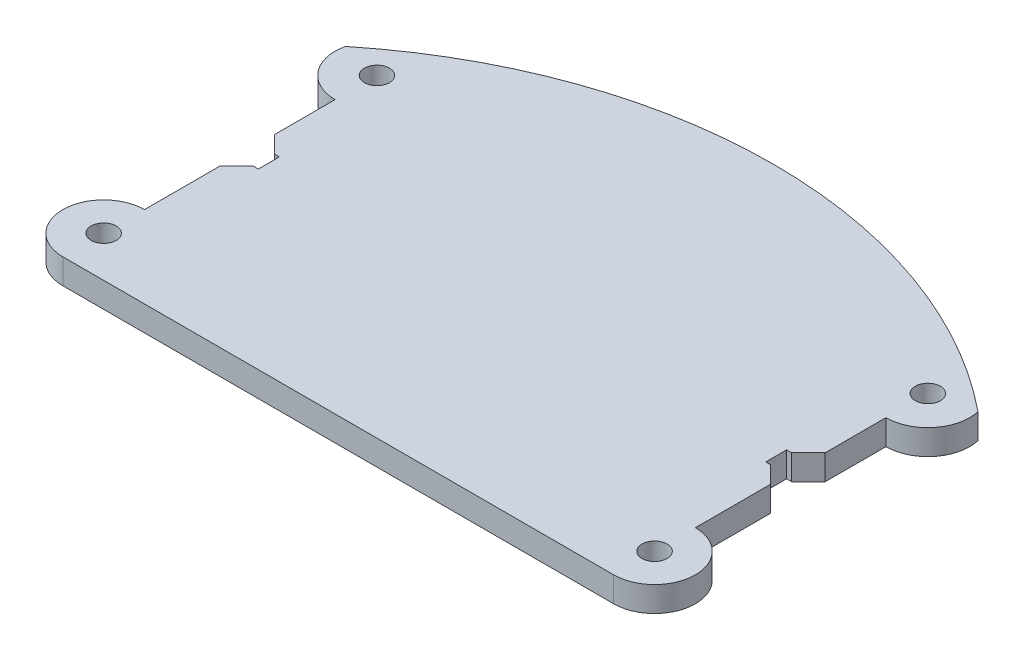
ISO-10303-21;
HEADER;
FILE_DESCRIPTION(('STEP AP214'),'2;1');
FILE_NAME('part.step','',(''),(''),'','','');
FILE_SCHEMA(('AUTOMOTIVE_DESIGN { 1 0 10303 214 1 1 1 1 }'));
ENDSEC;
DATA;
#1=APPLICATION_CONTEXT('core data for automotive mechanical design processes');
#2=APPLICATION_PROTOCOL_DEFINITION('international standard','automotive_design',2000,#1);
#3=PRODUCT_CONTEXT('',#1,'mechanical');
#4=PRODUCT('Part','Part','',(#3));
#5=PRODUCT_RELATED_PRODUCT_CATEGORY('part','',(#4));
#6=PRODUCT_DEFINITION_FORMATION('','',#4);
#7=PRODUCT_DEFINITION_CONTEXT('part definition',#1,'design');
#8=PRODUCT_DEFINITION('design','',#6,#7);
#9=PRODUCT_DEFINITION_SHAPE('','',#8);
#10=(LENGTH_UNIT() NAMED_UNIT(*) SI_UNIT(.MILLI.,.METRE.));
#11=(NAMED_UNIT(*) PLANE_ANGLE_UNIT() SI_UNIT($,.RADIAN.));
#12=(NAMED_UNIT(*) SI_UNIT($,.STERADIAN.) SOLID_ANGLE_UNIT());
#13=UNCERTAINTY_MEASURE_WITH_UNIT(LENGTH_MEASURE(1.E-05),#10,'distance_accuracy_value','');
#14=(GEOMETRIC_REPRESENTATION_CONTEXT(3) GLOBAL_UNCERTAINTY_ASSIGNED_CONTEXT((#13)) GLOBAL_UNIT_ASSIGNED_CONTEXT((#10,
#11,#12)) REPRESENTATION_CONTEXT('',''));
#15=CARTESIAN_POINT('',(0.,0.,0.));
#16=DIRECTION('',(0.,0.,1.));
#17=DIRECTION('',(1.,0.,0.));
#18=AXIS2_PLACEMENT_3D('',#15,#16,#17);
#19=CARTESIAN_POINT('',(32.89,3.,27.6232998089796));
#20=DIRECTION('',(0.,-1.,0.));
#21=DIRECTION('',(0.,0.,-1.));
#22=AXIS2_PLACEMENT_3D('',#19,#20,#21);
#23=PLANE('',#22);
#24=CARTESIAN_POINT('',(32.89,3.,27.6232998089796));
#25=DIRECTION('',(0.,1.,0.));
#26=DIRECTION('',(0.,0.,-1.));
#27=AXIS2_PLACEMENT_3D('',#24,#25,#26);
#28=CIRCLE('',#27,4.87670019102038);
#29=CARTESIAN_POINT('',(32.89,3.,32.5));
#30=VERTEX_POINT('',#29);
#31=CARTESIAN_POINT('',(32.89,3.,22.7465996179592));
#32=VERTEX_POINT('',#31);
#33=EDGE_CURVE('E257',#30,#32,#28,.T.);
#34=ORIENTED_EDGE('',*,*,#33,.T.);
#35=DIRECTION('',(0.,0.,-1.));
#36=VECTOR('',#35,1.);
#37=CARTESIAN_POINT('',(32.89,3.,22.7465996179592));
#38=LINE('',#37,#36);
#39=CARTESIAN_POINT('',(32.89,3.,13.7495066911825));
#40=VERTEX_POINT('',#39);
#41=EDGE_CURVE('E135',#32,#40,#38,.T.);
#42=ORIENTED_EDGE('',*,*,#41,.T.);
#43=DIRECTION('',(-0.707106781186548,0.,-0.707106781186547));
#44=VECTOR('',#43,1.);
#45=CARTESIAN_POINT('',(32.89,3.,13.7495066911825));
#46=LINE('',#45,#44);
#47=CARTESIAN_POINT('',(30.89,3.,11.7495066911825));
#48=VERTEX_POINT('',#47);
#49=EDGE_CURVE('E314',#40,#48,#46,.T.);
#50=ORIENTED_EDGE('',*,*,#49,.T.);
#51=DIRECTION('',(-1.,0.,0.));
#52=VECTOR('',#51,1.);
#53=CARTESIAN_POINT('',(30.89,3.,11.7495066911825));
#54=LINE('',#53,#52);
#55=CARTESIAN_POINT('',(30.29,3.,11.7495066911825));
#56=VERTEX_POINT('',#55);
#57=EDGE_CURVE('E333',#48,#56,#54,.T.);
#58=ORIENTED_EDGE('',*,*,#57,.T.);
#59=DIRECTION('',(0.,0.,-1.));
#60=VECTOR('',#59,1.);
#61=CARTESIAN_POINT('',(30.29,3.,11.7495066911825));
#62=LINE('',#61,#60);
#63=CARTESIAN_POINT('',(30.29,3.,9.25000000000001));
#64=VERTEX_POINT('',#63);
#65=EDGE_CURVE('E330',#56,#64,#62,.T.);
#66=ORIENTED_EDGE('',*,*,#65,.T.);
#67=DIRECTION('',(1.,0.,0.));
#68=VECTOR('',#67,1.);
#69=CARTESIAN_POINT('',(30.89,3.,9.25000000000001));
#70=LINE('',#69,#68);
#71=CARTESIAN_POINT('',(30.89,3.,9.25000000000001));
#72=VERTEX_POINT('',#71);
#73=EDGE_CURVE('E332',#64,#72,#70,.T.);
#74=ORIENTED_EDGE('',*,*,#73,.T.);
#75=DIRECTION('',(0.707106781186548,0.,-0.707106781186547));
#76=VECTOR('',#75,1.);
#77=CARTESIAN_POINT('',(32.89,3.,7.25000000000001));
#78=LINE('',#77,#76);
#79=CARTESIAN_POINT('',(32.89,3.,7.25000000000001));
#80=VERTEX_POINT('',#79);
#81=EDGE_CURVE('E335',#72,#80,#78,.T.);
#82=ORIENTED_EDGE('',*,*,#81,.T.);
#83=DIRECTION('',(0.,0.,-1.));
#84=VECTOR('',#83,1.);
#85=CARTESIAN_POINT('',(32.89,3.,7.25000000000001));
#86=LINE('',#85,#84);
#87=CARTESIAN_POINT('',(32.89,3.,-0.00896283115192396));
#88=VERTEX_POINT('',#87);
#89=EDGE_CURVE('E341',#80,#88,#86,.T.);
#90=ORIENTED_EDGE('',*,*,#89,.T.);
#91=DIRECTION('',(0.999999979183116,0.,0.000204043542084163));
#92=VECTOR('',#91,1.);
#93=CARTESIAN_POINT('',(32.8920404352012,3.,-0.00896241481428945));
#94=LINE('',#93,#92);
#95=CARTESIAN_POINT('',(32.8920404352012,3.,-0.00896241481432563));
#96=VERTEX_POINT('',#95);
#97=EDGE_CURVE('E343',#88,#96,#94,.T.);
#98=ORIENTED_EDGE('',*,*,#97,.T.);
#99=CARTESIAN_POINT('',(32.8920404352012,3.,-5.00896241481425));
#100=DIRECTION('',(0.,1.,0.));
#101=DIRECTION('',(0.,0.,-1.));
#102=AXIS2_PLACEMENT_3D('',#99,#100,#101);
#103=CIRCLE('',#102,4.99999999999993);
#104=CARTESIAN_POINT('',(37.7667001910205,3.,-6.12147860121143));
#105=VERTEX_POINT('',#104);
#106=EDGE_CURVE('E345',#96,#105,#103,.T.);
#107=ORIENTED_EDGE('',*,*,#106,.T.);
#108=CARTESIAN_POINT('',(3.8792265493745E-13,3.,40.50122355859));
#109=DIRECTION('',(0.,1.,0.));
#110=DIRECTION('',(0.,0.,1.));
#111=AXIS2_PLACEMENT_3D('',#108,#109,#110);
#112=CIRCLE('',#111,59.9999999999996);
#113=CARTESIAN_POINT('',(-37.7667001910211,3.,-6.12147860121064));
#114=VERTEX_POINT('',#113);
#115=EDGE_CURVE('E347',#105,#114,#112,.T.);
#116=ORIENTED_EDGE('',*,*,#115,.T.);
#117=CARTESIAN_POINT('',(-32.8920404352019,3.,-5.00896241481361));
#118=DIRECTION('',(0.,1.,0.));
#119=DIRECTION('',(0.,0.,1.));
#120=AXIS2_PLACEMENT_3D('',#117,#118,#119);
#121=CIRCLE('',#120,4.99999999999991);
#122=CARTESIAN_POINT('',(-32.8920404352019,3.,-0.00896241481367077));
#123=VERTEX_POINT('',#122);
#124=EDGE_CURVE('E349',#114,#123,#121,.T.);
#125=ORIENTED_EDGE('',*,*,#124,.T.);
#126=DIRECTION('',(0.999999979183055,0.,-0.00020404384127519));
#127=VECTOR('',#126,1.);
#128=CARTESIAN_POINT('',(-32.8920404352019,3.,-0.00896241481367077));
#129=LINE('',#128,#127);
#130=CARTESIAN_POINT('',(-32.89,3.,-0.0089628311519159));
#131=VERTEX_POINT('',#130);
#132=EDGE_CURVE('E351',#123,#131,#129,.T.);
#133=ORIENTED_EDGE('',*,*,#132,.T.);
#134=DIRECTION('',(0.,0.,1.));
#135=VECTOR('',#134,1.);
#136=CARTESIAN_POINT('',(-32.89,3.,7.25000000000001));
#137=LINE('',#136,#135);
#138=CARTESIAN_POINT('',(-32.89,3.,7.25000000000001));
#139=VERTEX_POINT('',#138);
#140=EDGE_CURVE('E353',#131,#139,#137,.T.);
#141=ORIENTED_EDGE('',*,*,#140,.T.);
#142=DIRECTION('',(0.707106781186548,0.,0.707106781186547));
#143=VECTOR('',#142,1.);
#144=CARTESIAN_POINT('',(-32.89,3.,7.25000000000001));
#145=LINE('',#144,#143);
#146=CARTESIAN_POINT('',(-30.89,3.,9.25000000000001));
#147=VERTEX_POINT('',#146);
#148=EDGE_CURVE('E355',#139,#147,#145,.T.);
#149=ORIENTED_EDGE('',*,*,#148,.T.);
#150=DIRECTION('',(1.,0.,0.));
#151=VECTOR('',#150,1.);
#152=CARTESIAN_POINT('',(-30.89,3.,9.25000000000001));
#153=LINE('',#152,#151);
#154=CARTESIAN_POINT('',(-30.29,3.,9.25000000000001));
#155=VERTEX_POINT('',#154);
#156=EDGE_CURVE('E357',#147,#155,#153,.T.);
#157=ORIENTED_EDGE('',*,*,#156,.T.);
#158=DIRECTION('',(0.,0.,1.));
#159=VECTOR('',#158,1.);
#160=CARTESIAN_POINT('',(-30.29,3.,11.7495066911825));
#161=LINE('',#160,#159);
#162=CARTESIAN_POINT('',(-30.29,3.,11.7495066911825));
#163=VERTEX_POINT('',#162);
#164=EDGE_CURVE('E359',#155,#163,#161,.T.);
#165=ORIENTED_EDGE('',*,*,#164,.T.);
#166=DIRECTION('',(-1.,0.,0.));
#167=VECTOR('',#166,1.);
#168=CARTESIAN_POINT('',(-30.89,3.,11.7495066911825));
#169=LINE('',#168,#167);
#170=CARTESIAN_POINT('',(-30.89,3.,11.7495066911825));
#171=VERTEX_POINT('',#170);
#172=EDGE_CURVE('E361',#163,#171,#169,.T.);
#173=ORIENTED_EDGE('',*,*,#172,.T.);
#174=DIRECTION('',(-0.707106781186548,0.,0.707106781186547));
#175=VECTOR('',#174,1.);
#176=CARTESIAN_POINT('',(-32.89,3.,13.7495066911825));
#177=LINE('',#176,#175);
#178=CARTESIAN_POINT('',(-32.89,3.,13.7495066911825));
#179=VERTEX_POINT('',#178);
#180=EDGE_CURVE('E196',#171,#179,#177,.T.);
#181=ORIENTED_EDGE('',*,*,#180,.T.);
#182=DIRECTION('',(0.,0.,1.));
#183=VECTOR('',#182,1.);
#184=CARTESIAN_POINT('',(-32.89,3.,22.7465996179592));
#185=LINE('',#184,#183);
#186=CARTESIAN_POINT('',(-32.89,3.,22.7465996179592));
#187=VERTEX_POINT('',#186);
#188=EDGE_CURVE('E190',#179,#187,#185,.T.);
#189=ORIENTED_EDGE('',*,*,#188,.T.);
#190=CARTESIAN_POINT('',(-32.89,3.,27.6232998089796));
#191=DIRECTION('',(0.,1.,0.));
#192=DIRECTION('',(0.,0.,1.));
#193=AXIS2_PLACEMENT_3D('',#190,#191,#192);
#194=CIRCLE('',#193,4.87670019102038);
#195=CARTESIAN_POINT('',(-32.89,3.,32.5));
#196=VERTEX_POINT('',#195);
#197=EDGE_CURVE('E194',#187,#196,#194,.T.);
#198=ORIENTED_EDGE('',*,*,#197,.T.);
#199=DIRECTION('',(1.,0.,0.));
#200=VECTOR('',#199,1.);
#201=CARTESIAN_POINT('',(-32.89,3.,32.5));
#202=LINE('',#201,#200);
#203=EDGE_CURVE('E50',#196,#30,#202,.T.);
#204=ORIENTED_EDGE('',*,*,#203,.T.);
#205=EDGE_LOOP('',(#34,#42,#50,#58,#66,#74,#82,#90,#98,#107,#116,#125,#133,#141,#149,#157,#165,
#173,#181,#189,#198,#204));
#206=FACE_BOUND('',#205,.T.);
#207=CARTESIAN_POINT('',(-32.8920404352019,3.,-5.00896241481361));
#208=DIRECTION('',(0.,1.,0.));
#209=DIRECTION('',(0.,0.,1.));
#210=AXIS2_PLACEMENT_3D('',#207,#208,#209);
#211=CIRCLE('',#210,1.50000000000085);
#212=CARTESIAN_POINT('',(-32.8920404352019,3.,-3.50896241481276));
#213=VERTEX_POINT('',#212);
#214=EDGE_CURVE('E218',#213,#213,#211,.T.);
#215=ORIENTED_EDGE('',*,*,#214,.F.);
#216=EDGE_LOOP('',(#215));
#217=FACE_BOUND('',#216,.T.);
#218=CARTESIAN_POINT('',(32.8899999999999,3.,-5.00896241481362));
#219=DIRECTION('',(0.,1.,0.));
#220=DIRECTION('',(0.,0.,1.));
#221=AXIS2_PLACEMENT_3D('',#218,#219,#220);
#222=CIRCLE('',#221,1.49999999999939);
#223=CARTESIAN_POINT('',(32.8899999999999,3.,-3.50896241481423));
#224=VERTEX_POINT('',#223);
#225=EDGE_CURVE('E425',#224,#224,#222,.T.);
#226=ORIENTED_EDGE('',*,*,#225,.F.);
#227=EDGE_LOOP('',(#226));
#228=FACE_BOUND('',#227,.T.);
#229=CARTESIAN_POINT('',(-32.89,3.,27.6232998089796));
#230=DIRECTION('',(0.,1.,0.));
#231=DIRECTION('',(0.,0.,1.));
#232=AXIS2_PLACEMENT_3D('',#229,#230,#231);
#233=CIRCLE('',#232,1.5);
#234=CARTESIAN_POINT('',(-32.89,3.,29.1232998089796));
#235=VERTEX_POINT('',#234);
#236=EDGE_CURVE('E419',#235,#235,#233,.T.);
#237=ORIENTED_EDGE('',*,*,#236,.F.);
#238=EDGE_LOOP('',(#237));
#239=FACE_BOUND('',#238,.T.);
#240=CARTESIAN_POINT('',(32.89,3.,27.6232998089796));
#241=DIRECTION('',(0.,1.,0.));
#242=DIRECTION('',(0.,0.,1.));
#243=AXIS2_PLACEMENT_3D('',#240,#241,#242);
#244=CIRCLE('',#243,1.5);
#245=CARTESIAN_POINT('',(32.89,3.,29.1232998089796));
#246=VERTEX_POINT('',#245);
#247=EDGE_CURVE('E410',#246,#246,#244,.T.);
#248=ORIENTED_EDGE('',*,*,#247,.F.);
#249=EDGE_LOOP('',(#248));
#250=FACE_BOUND('',#249,.T.);
#251=ADVANCED_FACE('F33',(#206,#217,#228,#239,#250),#23,.F.);
#252=CARTESIAN_POINT('',(32.89,0.,27.6232998089796));
#253=DIRECTION('',(0.,-1.,0.));
#254=DIRECTION('',(0.,0.,-1.));
#255=AXIS2_PLACEMENT_3D('',#252,#253,#254);
#256=PLANE('',#255);
#257=CARTESIAN_POINT('',(-32.89,0.,27.6232998089796));
#258=DIRECTION('',(0.,1.,0.));
#259=DIRECTION('',(0.,0.,1.));
#260=AXIS2_PLACEMENT_3D('',#257,#258,#259);
#261=CIRCLE('',#260,1.5);
#262=CARTESIAN_POINT('',(-32.89,0.,29.1232998089796));
#263=VERTEX_POINT('',#262);
#264=EDGE_CURVE('E416',#263,#263,#261,.T.);
#265=ORIENTED_EDGE('',*,*,#264,.T.);
#266=EDGE_LOOP('',(#265));
#267=FACE_BOUND('',#266,.T.);
#268=CARTESIAN_POINT('',(-32.8920404352019,0.,-5.00896241481361));
#269=DIRECTION('',(0.,1.,0.));
#270=DIRECTION('',(0.,0.,1.));
#271=AXIS2_PLACEMENT_3D('',#268,#269,#270);
#272=CIRCLE('',#271,1.50000000000085);
#273=CARTESIAN_POINT('',(-32.8920404352019,0.,-3.50896241481276));
#274=VERTEX_POINT('',#273);
#275=EDGE_CURVE('E428',#274,#274,#272,.T.);
#276=ORIENTED_EDGE('',*,*,#275,.T.);
#277=EDGE_LOOP('',(#276));
#278=FACE_BOUND('',#277,.T.);
#279=CARTESIAN_POINT('',(32.89,0.,27.6232998089796));
#280=DIRECTION('',(0.,1.,0.));
#281=DIRECTION('',(0.,0.,-1.));
#282=AXIS2_PLACEMENT_3D('',#279,#280,#281);
#283=CIRCLE('',#282,4.87670019102038);
#284=CARTESIAN_POINT('',(32.89,0.,32.5));
#285=VERTEX_POINT('',#284);
#286=CARTESIAN_POINT('',(32.89,0.,22.7465996179592));
#287=VERTEX_POINT('',#286);
#288=EDGE_CURVE('E214',#285,#287,#283,.T.);
#289=ORIENTED_EDGE('',*,*,#288,.F.);
#290=DIRECTION('',(1.,0.,0.));
#291=VECTOR('',#290,1.);
#292=CARTESIAN_POINT('',(-32.89,0.,32.5));
#293=LINE('',#292,#291);
#294=CARTESIAN_POINT('',(-32.89,0.,32.5));
#295=VERTEX_POINT('',#294);
#296=EDGE_CURVE('E127',#295,#285,#293,.T.);
#297=ORIENTED_EDGE('',*,*,#296,.F.);
#298=CARTESIAN_POINT('',(-32.89,0.,27.6232998089796));
#299=DIRECTION('',(0.,1.,0.));
#300=DIRECTION('',(0.,0.,1.));
#301=AXIS2_PLACEMENT_3D('',#298,#299,#300);
#302=CIRCLE('',#301,4.87670019102038);
#303=CARTESIAN_POINT('',(-32.89,0.,22.7465996179592));
#304=VERTEX_POINT('',#303);
#305=EDGE_CURVE('E121',#304,#295,#302,.T.);
#306=ORIENTED_EDGE('',*,*,#305,.F.);
#307=DIRECTION('',(0.,0.,1.));
#308=VECTOR('',#307,1.);
#309=CARTESIAN_POINT('',(-32.89,0.,22.7465996179592));
#310=LINE('',#309,#308);
#311=CARTESIAN_POINT('',(-32.89,0.,13.7495066911825));
#312=VERTEX_POINT('',#311);
#313=EDGE_CURVE('E204',#312,#304,#310,.T.);
#314=ORIENTED_EDGE('',*,*,#313,.F.);
#315=DIRECTION('',(-0.707106781186548,0.,0.707106781186547));
#316=VECTOR('',#315,1.);
#317=CARTESIAN_POINT('',(-32.89,0.,13.7495066911825));
#318=LINE('',#317,#316);
#319=CARTESIAN_POINT('',(-30.89,0.,11.7495066911825));
#320=VERTEX_POINT('',#319);
#321=EDGE_CURVE('E252',#320,#312,#318,.T.);
#322=ORIENTED_EDGE('',*,*,#321,.F.);
#323=DIRECTION('',(-1.,0.,0.));
#324=VECTOR('',#323,1.);
#325=CARTESIAN_POINT('',(-30.89,0.,11.7495066911825));
#326=LINE('',#325,#324);
#327=CARTESIAN_POINT('',(-30.29,0.,11.7495066911825));
#328=VERTEX_POINT('',#327);
#329=EDGE_CURVE('E250',#328,#320,#326,.T.);
#330=ORIENTED_EDGE('',*,*,#329,.F.);
#331=DIRECTION('',(0.,0.,1.));
#332=VECTOR('',#331,1.);
#333=CARTESIAN_POINT('',(-30.29,0.,11.7495066911825));
#334=LINE('',#333,#332);
#335=CARTESIAN_POINT('',(-30.29,0.,9.25000000000001));
#336=VERTEX_POINT('',#335);
#337=EDGE_CURVE('E248',#336,#328,#334,.T.);
#338=ORIENTED_EDGE('',*,*,#337,.F.);
#339=DIRECTION('',(1.,0.,0.));
#340=VECTOR('',#339,1.);
#341=CARTESIAN_POINT('',(-30.89,0.,9.25000000000001));
#342=LINE('',#341,#340);
#343=CARTESIAN_POINT('',(-30.89,0.,9.25000000000001));
#344=VERTEX_POINT('',#343);
#345=EDGE_CURVE('E246',#344,#336,#342,.T.);
#346=ORIENTED_EDGE('',*,*,#345,.F.);
#347=DIRECTION('',(0.707106781186548,0.,0.707106781186547));
#348=VECTOR('',#347,1.);
#349=CARTESIAN_POINT('',(-32.89,0.,7.25000000000001));
#350=LINE('',#349,#348);
#351=CARTESIAN_POINT('',(-32.89,0.,7.25000000000001));
#352=VERTEX_POINT('',#351);
#353=EDGE_CURVE('E244',#352,#344,#350,.T.);
#354=ORIENTED_EDGE('',*,*,#353,.F.);
#355=DIRECTION('',(0.,0.,1.));
#356=VECTOR('',#355,1.);
#357=CARTESIAN_POINT('',(-32.89,0.,7.25000000000001));
#358=LINE('',#357,#356);
#359=CARTESIAN_POINT('',(-32.89,0.,-0.0089628311519159));
#360=VERTEX_POINT('',#359);
#361=EDGE_CURVE('E242',#360,#352,#358,.T.);
#362=ORIENTED_EDGE('',*,*,#361,.F.);
#363=DIRECTION('',(0.999999979183055,0.,-0.00020404384127519));
#364=VECTOR('',#363,1.);
#365=CARTESIAN_POINT('',(-32.8920404352019,0.,-0.00896241481367077));
#366=LINE('',#365,#364);
#367=CARTESIAN_POINT('',(-32.8920404352019,0.,-0.00896241481367077));
#368=VERTEX_POINT('',#367);
#369=EDGE_CURVE('E240',#368,#360,#366,.T.);
#370=ORIENTED_EDGE('',*,*,#369,.F.);
#371=CARTESIAN_POINT('',(-32.8920404352019,0.,-5.00896241481361));
#372=DIRECTION('',(0.,1.,0.));
#373=DIRECTION('',(0.,0.,1.));
#374=AXIS2_PLACEMENT_3D('',#371,#372,#373);
#375=CIRCLE('',#374,4.99999999999991);
#376=CARTESIAN_POINT('',(-37.7667001910211,0.,-6.12147860121064));
#377=VERTEX_POINT('',#376);
#378=EDGE_CURVE('E238',#377,#368,#375,.T.);
#379=ORIENTED_EDGE('',*,*,#378,.F.);
#380=CARTESIAN_POINT('',(3.8792265493745E-13,0.,40.50122355859));
#381=DIRECTION('',(0.,1.,0.));
#382=DIRECTION('',(0.,0.,1.));
#383=AXIS2_PLACEMENT_3D('',#380,#381,#382);
#384=CIRCLE('',#383,59.9999999999996);
#385=CARTESIAN_POINT('',(37.7667001910205,0.,-6.12147860121143));
#386=VERTEX_POINT('',#385);
#387=EDGE_CURVE('E236',#386,#377,#384,.T.);
#388=ORIENTED_EDGE('',*,*,#387,.F.);
#389=CARTESIAN_POINT('',(32.8920404352012,0.,-5.00896241481425));
#390=DIRECTION('',(0.,1.,0.));
#391=DIRECTION('',(0.,0.,-1.));
#392=AXIS2_PLACEMENT_3D('',#389,#390,#391);
#393=CIRCLE('',#392,4.99999999999993);
#394=CARTESIAN_POINT('',(32.8920404352012,0.,-0.00896241481432563));
#395=VERTEX_POINT('',#394);
#396=EDGE_CURVE('E234',#395,#386,#393,.T.);
#397=ORIENTED_EDGE('',*,*,#396,.F.);
#398=DIRECTION('',(0.999999979183116,0.,0.000204043542084163));
#399=VECTOR('',#398,1.);
#400=CARTESIAN_POINT('',(32.8920404352012,0.,-0.00896241481428945));
#401=LINE('',#400,#399);
#402=CARTESIAN_POINT('',(32.89,0.,-0.00896283115192396));
#403=VERTEX_POINT('',#402);
#404=EDGE_CURVE('E232',#403,#395,#401,.T.);
#405=ORIENTED_EDGE('',*,*,#404,.F.);
#406=DIRECTION('',(0.,0.,-1.));
#407=VECTOR('',#406,1.);
#408=CARTESIAN_POINT('',(32.89,0.,7.25000000000001));
#409=LINE('',#408,#407);
#410=CARTESIAN_POINT('',(32.89,0.,7.25000000000001));
#411=VERTEX_POINT('',#410);
#412=EDGE_CURVE('E230',#411,#403,#409,.T.);
#413=ORIENTED_EDGE('',*,*,#412,.F.);
#414=DIRECTION('',(0.707106781186548,0.,-0.707106781186547));
#415=VECTOR('',#414,1.);
#416=CARTESIAN_POINT('',(32.89,0.,7.25000000000001));
#417=LINE('',#416,#415);
#418=CARTESIAN_POINT('',(30.89,0.,9.25000000000001));
#419=VERTEX_POINT('',#418);
#420=EDGE_CURVE('E228',#419,#411,#417,.T.);
#421=ORIENTED_EDGE('',*,*,#420,.F.);
#422=DIRECTION('',(1.,0.,0.));
#423=VECTOR('',#422,1.);
#424=CARTESIAN_POINT('',(30.89,0.,9.25000000000001));
#425=LINE('',#424,#423);
#426=CARTESIAN_POINT('',(30.29,0.,9.25000000000001));
#427=VERTEX_POINT('',#426);
#428=EDGE_CURVE('E226',#427,#419,#425,.T.);
#429=ORIENTED_EDGE('',*,*,#428,.F.);
#430=DIRECTION('',(0.,0.,-1.));
#431=VECTOR('',#430,1.);
#432=CARTESIAN_POINT('',(30.29,0.,11.7495066911825));
#433=LINE('',#432,#431);
#434=CARTESIAN_POINT('',(30.29,0.,11.7495066911825));
#435=VERTEX_POINT('',#434);
#436=EDGE_CURVE('E224',#435,#427,#433,.T.);
#437=ORIENTED_EDGE('',*,*,#436,.F.);
#438=DIRECTION('',(-1.,0.,0.));
#439=VECTOR('',#438,1.);
#440=CARTESIAN_POINT('',(30.89,0.,11.7495066911825));
#441=LINE('',#440,#439);
#442=CARTESIAN_POINT('',(30.89,0.,11.7495066911825));
#443=VERTEX_POINT('',#442);
#444=EDGE_CURVE('E222',#443,#435,#441,.T.);
#445=ORIENTED_EDGE('',*,*,#444,.F.);
#446=DIRECTION('',(-0.707106781186548,0.,-0.707106781186547));
#447=VECTOR('',#446,1.);
#448=CARTESIAN_POINT('',(32.89,0.,13.7495066911825));
#449=LINE('',#448,#447);
#450=CARTESIAN_POINT('',(32.89,0.,13.7495066911825));
#451=VERTEX_POINT('',#450);
#452=EDGE_CURVE('E220',#451,#443,#449,.T.);
#453=ORIENTED_EDGE('',*,*,#452,.F.);
#454=DIRECTION('',(0.,0.,-1.));
#455=VECTOR('',#454,1.);
#456=CARTESIAN_POINT('',(32.89,0.,22.7465996179592));
#457=LINE('',#456,#455);
#458=EDGE_CURVE('E217',#287,#451,#457,.T.);
#459=ORIENTED_EDGE('',*,*,#458,.F.);
#460=EDGE_LOOP('',(#289,#297,#306,#314,#322,#330,#338,#346,#354,#362,#370,#379,#388,#397,#405,
#413,#421,#429,#437,#445,#453,#459));
#461=FACE_BOUND('',#460,.T.);
#462=CARTESIAN_POINT('',(32.8899999999999,0.,-5.00896241481362));
#463=DIRECTION('',(0.,1.,0.));
#464=DIRECTION('',(0.,0.,1.));
#465=AXIS2_PLACEMENT_3D('',#462,#463,#464);
#466=CIRCLE('',#465,1.49999999999939);
#467=CARTESIAN_POINT('',(32.8899999999999,0.,-3.50896241481423));
#468=VERTEX_POINT('',#467);
#469=EDGE_CURVE('E422',#468,#468,#466,.T.);
#470=ORIENTED_EDGE('',*,*,#469,.T.);
#471=EDGE_LOOP('',(#470));
#472=FACE_BOUND('',#471,.T.);
#473=CARTESIAN_POINT('',(32.89,0.,27.6232998089796));
#474=DIRECTION('',(0.,1.,0.));
#475=DIRECTION('',(0.,0.,1.));
#476=AXIS2_PLACEMENT_3D('',#473,#474,#475);
#477=CIRCLE('',#476,1.5);
#478=CARTESIAN_POINT('',(32.89,0.,29.1232998089796));
#479=VERTEX_POINT('',#478);
#480=EDGE_CURVE('E413',#479,#479,#477,.T.);
#481=ORIENTED_EDGE('',*,*,#480,.T.);
#482=EDGE_LOOP('',(#481));
#483=FACE_BOUND('',#482,.T.);
#484=ADVANCED_FACE('F318',(#267,#278,#461,#472,#483),#256,.T.);
#485=CARTESIAN_POINT('',(32.89,3.,27.6232998089796));
#486=DIRECTION('',(0.,-1.,0.));
#487=DIRECTION('',(0.,0.,-1.));
#488=AXIS2_PLACEMENT_3D('',#485,#486,#487);
#489=CYLINDRICAL_SURFACE('',#488,4.87670019102038);
#490=ORIENTED_EDGE('',*,*,#288,.T.);
#491=DIRECTION('',(0.,-1.,0.));
#492=VECTOR('',#491,1.);
#493=CARTESIAN_POINT('',(32.89,3.,22.7465996179592));
#494=LINE('',#493,#492);
#495=EDGE_CURVE('E11',#32,#287,#494,.T.);
#496=ORIENTED_EDGE('',*,*,#495,.F.);
#497=ORIENTED_EDGE('',*,*,#33,.F.);
#498=DIRECTION('',(0.,-1.,0.));
#499=VECTOR('',#498,1.);
#500=CARTESIAN_POINT('',(32.89,3.,32.5));
#501=LINE('',#500,#499);
#502=EDGE_CURVE('E210',#30,#285,#501,.T.);
#503=ORIENTED_EDGE('',*,*,#502,.T.);
#504=EDGE_LOOP('',(#490,#496,#497,#503));
#505=FACE_BOUND('',#504,.T.);
#506=ADVANCED_FACE('F35',(#505),#489,.T.);
#507=CARTESIAN_POINT('',(32.89,3.,22.7465996179592));
#508=DIRECTION('',(-1.,0.,0.));
#509=DIRECTION('',(0.,0.,1.));
#510=AXIS2_PLACEMENT_3D('',#507,#508,#509);
#511=PLANE('',#510);
#512=ORIENTED_EDGE('',*,*,#458,.T.);
#513=DIRECTION('',(0.,-1.,0.));
#514=VECTOR('',#513,1.);
#515=CARTESIAN_POINT('',(32.89,3.,13.7495066911825));
#516=LINE('',#515,#514);
#517=EDGE_CURVE('E42',#40,#451,#516,.T.);
#518=ORIENTED_EDGE('',*,*,#517,.F.);
#519=ORIENTED_EDGE('',*,*,#41,.F.);
#520=ORIENTED_EDGE('',*,*,#495,.T.);
#521=EDGE_LOOP('',(#512,#518,#519,#520));
#522=FACE_BOUND('',#521,.T.);
#523=ADVANCED_FACE('F640',(#522),#511,.F.);
#524=CARTESIAN_POINT('',(32.89,3.,13.7495066911825));
#525=DIRECTION('',(-0.707106781186547,0.,0.707106781186548));
#526=DIRECTION('',(0.707106781186548,0.,0.707106781186547));
#527=AXIS2_PLACEMENT_3D('',#524,#525,#526);
#528=PLANE('',#527);
#529=ORIENTED_EDGE('',*,*,#452,.T.);
#530=DIRECTION('',(0.,-1.,0.));
#531=VECTOR('',#530,1.);
#532=CARTESIAN_POINT('',(30.89,3.,11.7495066911825));
#533=LINE('',#532,#531);
#534=EDGE_CURVE('E306',#48,#443,#533,.T.);
#535=ORIENTED_EDGE('',*,*,#534,.F.);
#536=ORIENTED_EDGE('',*,*,#49,.F.);
#537=ORIENTED_EDGE('',*,*,#517,.T.);
#538=EDGE_LOOP('',(#529,#535,#536,#537));
#539=FACE_BOUND('',#538,.T.);
#540=ADVANCED_FACE('F312',(#539),#528,.F.);
#541=CARTESIAN_POINT('',(30.89,3.,11.7495066911825));
#542=DIRECTION('',(0.,0.,1.));
#543=DIRECTION('',(1.,0.,0.));
#544=AXIS2_PLACEMENT_3D('',#541,#542,#543);
#545=PLANE('',#544);
#546=ORIENTED_EDGE('',*,*,#444,.T.);
#547=DIRECTION('',(0.,-1.,0.));
#548=VECTOR('',#547,1.);
#549=CARTESIAN_POINT('',(30.29,3.,11.7495066911825));
#550=LINE('',#549,#548);
#551=EDGE_CURVE('E303',#56,#435,#550,.T.);
#552=ORIENTED_EDGE('',*,*,#551,.F.);
#553=ORIENTED_EDGE('',*,*,#57,.F.);
#554=ORIENTED_EDGE('',*,*,#534,.T.);
#555=EDGE_LOOP('',(#546,#552,#553,#554));
#556=FACE_BOUND('',#555,.T.);
#557=ADVANCED_FACE('F324',(#556),#545,.F.);
#558=CARTESIAN_POINT('',(30.29,3.,11.7495066911825));
#559=DIRECTION('',(-1.,0.,0.));
#560=DIRECTION('',(0.,0.,1.));
#561=AXIS2_PLACEMENT_3D('',#558,#559,#560);
#562=PLANE('',#561);
#563=ORIENTED_EDGE('',*,*,#436,.T.);
#564=DIRECTION('',(0.,-1.,0.));
#565=VECTOR('',#564,1.);
#566=CARTESIAN_POINT('',(30.29,3.,9.25000000000001));
#567=LINE('',#566,#565);
#568=EDGE_CURVE('E300',#64,#427,#567,.T.);
#569=ORIENTED_EDGE('',*,*,#568,.F.);
#570=ORIENTED_EDGE('',*,*,#65,.F.);
#571=ORIENTED_EDGE('',*,*,#551,.T.);
#572=EDGE_LOOP('',(#563,#569,#570,#571));
#573=FACE_BOUND('',#572,.T.);
#574=ADVANCED_FACE('F328',(#573),#562,.F.);
#575=CARTESIAN_POINT('',(30.89,3.,9.25000000000001));
#576=DIRECTION('',(0.,0.,-1.));
#577=DIRECTION('',(-1.,0.,0.));
#578=AXIS2_PLACEMENT_3D('',#575,#576,#577);
#579=PLANE('',#578);
#580=ORIENTED_EDGE('',*,*,#428,.T.);
#581=DIRECTION('',(0.,-1.,0.));
#582=VECTOR('',#581,1.);
#583=CARTESIAN_POINT('',(30.89,3.,9.25000000000001));
#584=LINE('',#583,#582);
#585=EDGE_CURVE('E297',#72,#419,#584,.T.);
#586=ORIENTED_EDGE('',*,*,#585,.F.);
#587=ORIENTED_EDGE('',*,*,#73,.F.);
#588=ORIENTED_EDGE('',*,*,#568,.T.);
#589=EDGE_LOOP('',(#580,#586,#587,#588));
#590=FACE_BOUND('',#589,.T.);
#591=ADVANCED_FACE('F605',(#590),#579,.F.);
#592=CARTESIAN_POINT('',(32.89,3.,7.25000000000001));
#593=DIRECTION('',(-0.707106781186547,0.,-0.707106781186548));
#594=DIRECTION('',(-0.707106781186548,0.,0.707106781186547));
#595=AXIS2_PLACEMENT_3D('',#592,#593,#594);
#596=PLANE('',#595);
#597=ORIENTED_EDGE('',*,*,#420,.T.);
#598=DIRECTION('',(0.,-1.,0.));
#599=VECTOR('',#598,1.);
#600=CARTESIAN_POINT('',(32.89,3.,7.25000000000001));
#601=LINE('',#600,#599);
#602=EDGE_CURVE('E294',#80,#411,#601,.T.);
#603=ORIENTED_EDGE('',*,*,#602,.F.);
#604=ORIENTED_EDGE('',*,*,#81,.F.);
#605=ORIENTED_EDGE('',*,*,#585,.T.);
#606=EDGE_LOOP('',(#597,#603,#604,#605));
#607=FACE_BOUND('',#606,.T.);
#608=ADVANCED_FACE('F595',(#607),#596,.F.);
#609=CARTESIAN_POINT('',(32.89,3.,7.25000000000001));
#610=DIRECTION('',(-1.,0.,0.));
#611=DIRECTION('',(0.,0.,1.));
#612=AXIS2_PLACEMENT_3D('',#609,#610,#611);
#613=PLANE('',#612);
#614=ORIENTED_EDGE('',*,*,#412,.T.);
#615=DIRECTION('',(0.,-1.,0.));
#616=VECTOR('',#615,1.);
#617=CARTESIAN_POINT('',(32.89,3.,-0.00896283115192396));
#618=LINE('',#617,#616);
#619=EDGE_CURVE('E291',#88,#403,#618,.T.);
#620=ORIENTED_EDGE('',*,*,#619,.F.);
#621=ORIENTED_EDGE('',*,*,#89,.F.);
#622=ORIENTED_EDGE('',*,*,#602,.T.);
#623=EDGE_LOOP('',(#614,#620,#621,#622));
#624=FACE_BOUND('',#623,.T.);
#625=ADVANCED_FACE('F585',(#624),#613,.F.);
#626=CARTESIAN_POINT('',(32.8920404352012,3.,-0.00896241481428945));
#627=DIRECTION('',(0.000204043542084163,0.,-0.999999979183116));
#628=DIRECTION('',(-0.999999979183116,0.,-0.000204043542084163));
#629=AXIS2_PLACEMENT_3D('',#626,#627,#628);
#630=PLANE('',#629);
#631=ORIENTED_EDGE('',*,*,#404,.T.);
#632=DIRECTION('',(0.,-1.,0.));
#633=VECTOR('',#632,1.);
#634=CARTESIAN_POINT('',(32.8920404352012,3.,-0.00896241481432563));
#635=LINE('',#634,#633);
#636=EDGE_CURVE('E288',#96,#395,#635,.T.);
#637=ORIENTED_EDGE('',*,*,#636,.F.);
#638=ORIENTED_EDGE('',*,*,#97,.F.);
#639=ORIENTED_EDGE('',*,*,#619,.T.);
#640=EDGE_LOOP('',(#631,#637,#638,#639));
#641=FACE_BOUND('',#640,.T.);
#642=ADVANCED_FACE('F575',(#641),#630,.F.);
#643=CARTESIAN_POINT('',(32.8920404352012,3.,-5.00896241481425));
#644=DIRECTION('',(0.,-1.,0.));
#645=DIRECTION('',(0.,0.,-1.));
#646=AXIS2_PLACEMENT_3D('',#643,#644,#645);
#647=CYLINDRICAL_SURFACE('',#646,4.99999999999993);
#648=ORIENTED_EDGE('',*,*,#396,.T.);
#649=DIRECTION('',(0.,-1.,0.));
#650=VECTOR('',#649,1.);
#651=CARTESIAN_POINT('',(37.7667001910205,3.,-6.12147860121143));
#652=LINE('',#651,#650);
#653=EDGE_CURVE('E285',#105,#386,#652,.T.);
#654=ORIENTED_EDGE('',*,*,#653,.F.);
#655=ORIENTED_EDGE('',*,*,#106,.F.);
#656=ORIENTED_EDGE('',*,*,#636,.T.);
#657=EDGE_LOOP('',(#648,#654,#655,#656));
#658=FACE_BOUND('',#657,.T.);
#659=ADVANCED_FACE('F565',(#658),#647,.T.);
#660=CARTESIAN_POINT('',(3.8792265493745E-13,3.,40.50122355859));
#661=DIRECTION('',(0.,-1.,0.));
#662=DIRECTION('',(0.,0.,-1.));
#663=AXIS2_PLACEMENT_3D('',#660,#661,#662);
#664=CYLINDRICAL_SURFACE('',#663,59.9999999999996);
#665=ORIENTED_EDGE('',*,*,#387,.T.);
#666=DIRECTION('',(0.,-1.,0.));
#667=VECTOR('',#666,1.);
#668=CARTESIAN_POINT('',(-37.7667001910211,3.,-6.12147860121064));
#669=LINE('',#668,#667);
#670=EDGE_CURVE('E282',#114,#377,#669,.T.);
#671=ORIENTED_EDGE('',*,*,#670,.F.);
#672=ORIENTED_EDGE('',*,*,#115,.F.);
#673=ORIENTED_EDGE('',*,*,#653,.T.);
#674=EDGE_LOOP('',(#665,#671,#672,#673));
#675=FACE_BOUND('',#674,.T.);
#676=ADVANCED_FACE('F555',(#675),#664,.T.);
#677=CARTESIAN_POINT('',(-32.8920404352019,3.,-5.00896241481361));
#678=DIRECTION('',(0.,-1.,0.));
#679=DIRECTION('',(0.,0.,-1.));
#680=AXIS2_PLACEMENT_3D('',#677,#678,#679);
#681=CYLINDRICAL_SURFACE('',#680,4.99999999999991);
#682=ORIENTED_EDGE('',*,*,#378,.T.);
#683=DIRECTION('',(0.,-1.,0.));
#684=VECTOR('',#683,1.);
#685=CARTESIAN_POINT('',(-32.8920404352019,3.,-0.00896241481367077));
#686=LINE('',#685,#684);
#687=EDGE_CURVE('E279',#123,#368,#686,.T.);
#688=ORIENTED_EDGE('',*,*,#687,.F.);
#689=ORIENTED_EDGE('',*,*,#124,.F.);
#690=ORIENTED_EDGE('',*,*,#670,.T.);
#691=EDGE_LOOP('',(#682,#688,#689,#690));
#692=FACE_BOUND('',#691,.T.);
#693=ADVANCED_FACE('F545',(#692),#681,.T.);
#694=CARTESIAN_POINT('',(-32.8920404352019,3.,-0.00896241481367077));
#695=DIRECTION('',(-0.00020404384127519,0.,-0.999999979183055));
#696=DIRECTION('',(-0.999999979183055,0.,0.00020404384127519));
#697=AXIS2_PLACEMENT_3D('',#694,#695,#696);
#698=PLANE('',#697);
#699=ORIENTED_EDGE('',*,*,#369,.T.);
#700=DIRECTION('',(0.,-1.,0.));
#701=VECTOR('',#700,1.);
#702=CARTESIAN_POINT('',(-32.89,3.,-0.0089628311519159));
#703=LINE('',#702,#701);
#704=EDGE_CURVE('E276',#131,#360,#703,.T.);
#705=ORIENTED_EDGE('',*,*,#704,.F.);
#706=ORIENTED_EDGE('',*,*,#132,.F.);
#707=ORIENTED_EDGE('',*,*,#687,.T.);
#708=EDGE_LOOP('',(#699,#705,#706,#707));
#709=FACE_BOUND('',#708,.T.);
#710=ADVANCED_FACE('F535',(#709),#698,.F.);
#711=CARTESIAN_POINT('',(-32.89,3.,7.25000000000001));
#712=DIRECTION('',(1.,0.,0.));
#713=DIRECTION('',(0.,0.,-1.));
#714=AXIS2_PLACEMENT_3D('',#711,#712,#713);
#715=PLANE('',#714);
#716=ORIENTED_EDGE('',*,*,#361,.T.);
#717=DIRECTION('',(0.,-1.,0.));
#718=VECTOR('',#717,1.);
#719=CARTESIAN_POINT('',(-32.89,3.,7.25000000000001));
#720=LINE('',#719,#718);
#721=EDGE_CURVE('E273',#139,#352,#720,.T.);
#722=ORIENTED_EDGE('',*,*,#721,.F.);
#723=ORIENTED_EDGE('',*,*,#140,.F.);
#724=ORIENTED_EDGE('',*,*,#704,.T.);
#725=EDGE_LOOP('',(#716,#722,#723,#724));
#726=FACE_BOUND('',#725,.T.);
#727=ADVANCED_FACE('F525',(#726),#715,.F.);
#728=CARTESIAN_POINT('',(-32.89,3.,7.25000000000001));
#729=DIRECTION('',(0.707106781186547,0.,-0.707106781186548));
#730=DIRECTION('',(-0.707106781186548,0.,-0.707106781186547));
#731=AXIS2_PLACEMENT_3D('',#728,#729,#730);
#732=PLANE('',#731);
#733=ORIENTED_EDGE('',*,*,#353,.T.);
#734=DIRECTION('',(0.,-1.,0.));
#735=VECTOR('',#734,1.);
#736=CARTESIAN_POINT('',(-30.89,3.,9.25000000000001));
#737=LINE('',#736,#735);
#738=EDGE_CURVE('E270',#147,#344,#737,.T.);
#739=ORIENTED_EDGE('',*,*,#738,.F.);
#740=ORIENTED_EDGE('',*,*,#148,.F.);
#741=ORIENTED_EDGE('',*,*,#721,.T.);
#742=EDGE_LOOP('',(#733,#739,#740,#741));
#743=FACE_BOUND('',#742,.T.);
#744=ADVANCED_FACE('F515',(#743),#732,.F.);
#745=CARTESIAN_POINT('',(-30.89,3.,9.25000000000001));
#746=DIRECTION('',(0.,0.,-1.));
#747=DIRECTION('',(-1.,0.,0.));
#748=AXIS2_PLACEMENT_3D('',#745,#746,#747);
#749=PLANE('',#748);
#750=ORIENTED_EDGE('',*,*,#345,.T.);
#751=DIRECTION('',(0.,-1.,0.));
#752=VECTOR('',#751,1.);
#753=CARTESIAN_POINT('',(-30.29,3.,9.25000000000001));
#754=LINE('',#753,#752);
#755=EDGE_CURVE('E267',#155,#336,#754,.T.);
#756=ORIENTED_EDGE('',*,*,#755,.F.);
#757=ORIENTED_EDGE('',*,*,#156,.F.);
#758=ORIENTED_EDGE('',*,*,#738,.T.);
#759=EDGE_LOOP('',(#750,#756,#757,#758));
#760=FACE_BOUND('',#759,.T.);
#761=ADVANCED_FACE('F505',(#760),#749,.F.);
#762=CARTESIAN_POINT('',(-30.29,3.,11.7495066911825));
#763=DIRECTION('',(1.,0.,0.));
#764=DIRECTION('',(0.,0.,-1.));
#765=AXIS2_PLACEMENT_3D('',#762,#763,#764);
#766=PLANE('',#765);
#767=ORIENTED_EDGE('',*,*,#337,.T.);
#768=DIRECTION('',(0.,-1.,0.));
#769=VECTOR('',#768,1.);
#770=CARTESIAN_POINT('',(-30.29,3.,11.7495066911825));
#771=LINE('',#770,#769);
#772=EDGE_CURVE('E264',#163,#328,#771,.T.);
#773=ORIENTED_EDGE('',*,*,#772,.F.);
#774=ORIENTED_EDGE('',*,*,#164,.F.);
#775=ORIENTED_EDGE('',*,*,#755,.T.);
#776=EDGE_LOOP('',(#767,#773,#774,#775));
#777=FACE_BOUND('',#776,.T.);
#778=ADVANCED_FACE('F496',(#777),#766,.F.);
#779=CARTESIAN_POINT('',(-30.89,3.,11.7495066911825));
#780=DIRECTION('',(0.,0.,1.));
#781=DIRECTION('',(1.,0.,0.));
#782=AXIS2_PLACEMENT_3D('',#779,#780,#781);
#783=PLANE('',#782);
#784=ORIENTED_EDGE('',*,*,#329,.T.);
#785=DIRECTION('',(0.,-1.,0.));
#786=VECTOR('',#785,1.);
#787=CARTESIAN_POINT('',(-30.89,3.,11.7495066911825));
#788=LINE('',#787,#786);
#789=EDGE_CURVE('E261',#171,#320,#788,.T.);
#790=ORIENTED_EDGE('',*,*,#789,.F.);
#791=ORIENTED_EDGE('',*,*,#172,.F.);
#792=ORIENTED_EDGE('',*,*,#772,.T.);
#793=EDGE_LOOP('',(#784,#790,#791,#792));
#794=FACE_BOUND('',#793,.T.);
#795=ADVANCED_FACE('F367',(#794),#783,.F.);
#796=CARTESIAN_POINT('',(-32.89,3.,13.7495066911825));
#797=DIRECTION('',(0.707106781186547,0.,0.707106781186548));
#798=DIRECTION('',(0.707106781186548,0.,-0.707106781186547));
#799=AXIS2_PLACEMENT_3D('',#796,#797,#798);
#800=PLANE('',#799);
#801=ORIENTED_EDGE('',*,*,#321,.T.);
#802=DIRECTION('',(0.,-1.,0.));
#803=VECTOR('',#802,1.);
#804=CARTESIAN_POINT('',(-32.89,3.,13.7495066911825));
#805=LINE('',#804,#803);
#806=EDGE_CURVE('E205',#179,#312,#805,.T.);
#807=ORIENTED_EDGE('',*,*,#806,.F.);
#808=ORIENTED_EDGE('',*,*,#180,.F.);
#809=ORIENTED_EDGE('',*,*,#789,.T.);
#810=EDGE_LOOP('',(#801,#807,#808,#809));
#811=FACE_BOUND('',#810,.T.);
#812=ADVANCED_FACE('F371',(#811),#800,.F.);
#813=CARTESIAN_POINT('',(-32.89,3.,22.7465996179592));
#814=DIRECTION('',(1.,0.,0.));
#815=DIRECTION('',(0.,0.,-1.));
#816=AXIS2_PLACEMENT_3D('',#813,#814,#815);
#817=PLANE('',#816);
#818=ORIENTED_EDGE('',*,*,#313,.T.);
#819=DIRECTION('',(0.,-1.,0.));
#820=VECTOR('',#819,1.);
#821=CARTESIAN_POINT('',(-32.89,3.,22.7465996179592));
#822=LINE('',#821,#820);
#823=EDGE_CURVE('E201',#187,#304,#822,.T.);
#824=ORIENTED_EDGE('',*,*,#823,.F.);
#825=ORIENTED_EDGE('',*,*,#188,.F.);
#826=ORIENTED_EDGE('',*,*,#806,.T.);
#827=EDGE_LOOP('',(#818,#824,#825,#826));
#828=FACE_BOUND('',#827,.T.);
#829=ADVANCED_FACE('F202',(#828),#817,.F.);
#830=CARTESIAN_POINT('',(-32.89,3.,27.6232998089796));
#831=DIRECTION('',(0.,-1.,0.));
#832=DIRECTION('',(0.,0.,-1.));
#833=AXIS2_PLACEMENT_3D('',#830,#831,#832);
#834=CYLINDRICAL_SURFACE('',#833,4.87670019102038);
#835=ORIENTED_EDGE('',*,*,#305,.T.);
#836=DIRECTION('',(0.,-1.,0.));
#837=VECTOR('',#836,1.);
#838=CARTESIAN_POINT('',(-32.89,3.,32.5));
#839=LINE('',#838,#837);
#840=EDGE_CURVE('E206',#196,#295,#839,.T.);
#841=ORIENTED_EDGE('',*,*,#840,.F.);
#842=ORIENTED_EDGE('',*,*,#197,.F.);
#843=ORIENTED_EDGE('',*,*,#823,.T.);
#844=EDGE_LOOP('',(#835,#841,#842,#843));
#845=FACE_BOUND('',#844,.T.);
#846=ADVANCED_FACE('F208',(#845),#834,.T.);
#847=CARTESIAN_POINT('',(-32.89,3.,32.5));
#848=DIRECTION('',(0.,0.,-1.));
#849=DIRECTION('',(-1.,0.,0.));
#850=AXIS2_PLACEMENT_3D('',#847,#848,#849);
#851=PLANE('',#850);
#852=ORIENTED_EDGE('',*,*,#296,.T.);
#853=ORIENTED_EDGE('',*,*,#502,.F.);
#854=ORIENTED_EDGE('',*,*,#203,.F.);
#855=ORIENTED_EDGE('',*,*,#840,.T.);
#856=EDGE_LOOP('',(#852,#853,#854,#855));
#857=FACE_BOUND('',#856,.T.);
#858=ADVANCED_FACE('F375',(#857),#851,.F.);
#859=CARTESIAN_POINT('',(-32.8920404352019,3.,-5.00896241481361));
#860=DIRECTION('',(0.,-1.,0.));
#861=DIRECTION('',(0.,0.,-1.));
#862=AXIS2_PLACEMENT_3D('',#859,#860,#861);
#863=CYLINDRICAL_SURFACE('',#862,1.50000000000085);
#864=ORIENTED_EDGE('',*,*,#214,.T.);
#865=EDGE_LOOP('',(#864));
#866=FACE_BOUND('',#865,.T.);
#867=ORIENTED_EDGE('',*,*,#275,.F.);
#868=EDGE_LOOP('',(#867));
#869=FACE_BOUND('',#868,.T.);
#870=ADVANCED_FACE('F377',(#866,#869),#863,.F.);
#871=CARTESIAN_POINT('',(32.8899999999999,3.,-5.00896241481362));
#872=DIRECTION('',(0.,-1.,0.));
#873=DIRECTION('',(0.,0.,-1.));
#874=AXIS2_PLACEMENT_3D('',#871,#872,#873);
#875=CYLINDRICAL_SURFACE('',#874,1.49999999999939);
#876=ORIENTED_EDGE('',*,*,#225,.T.);
#877=EDGE_LOOP('',(#876));
#878=FACE_BOUND('',#877,.T.);
#879=ORIENTED_EDGE('',*,*,#469,.F.);
#880=EDGE_LOOP('',(#879));
#881=FACE_BOUND('',#880,.T.);
#882=ADVANCED_FACE('F383',(#878,#881),#875,.F.);
#883=CARTESIAN_POINT('',(-32.89,3.,27.6232998089796));
#884=DIRECTION('',(0.,-1.,0.));
#885=DIRECTION('',(0.,0.,-1.));
#886=AXIS2_PLACEMENT_3D('',#883,#884,#885);
#887=CYLINDRICAL_SURFACE('',#886,1.5);
#888=ORIENTED_EDGE('',*,*,#236,.T.);
#889=EDGE_LOOP('',(#888));
#890=FACE_BOUND('',#889,.T.);
#891=ORIENTED_EDGE('',*,*,#264,.F.);
#892=EDGE_LOOP('',(#891));
#893=FACE_BOUND('',#892,.T.);
#894=ADVANCED_FACE('F397',(#890,#893),#887,.F.);
#895=CARTESIAN_POINT('',(32.89,3.,27.6232998089796));
#896=DIRECTION('',(0.,-1.,0.));
#897=DIRECTION('',(0.,0.,-1.));
#898=AXIS2_PLACEMENT_3D('',#895,#896,#897);
#899=CYLINDRICAL_SURFACE('',#898,1.5);
#900=ORIENTED_EDGE('',*,*,#247,.T.);
#901=EDGE_LOOP('',(#900));
#902=FACE_BOUND('',#901,.T.);
#903=ORIENTED_EDGE('',*,*,#480,.F.);
#904=EDGE_LOOP('',(#903));
#905=FACE_BOUND('',#904,.T.);
#906=ADVANCED_FACE('F401',(#902,#905),#899,.F.);
#907=CLOSED_SHELL('',(#251,#484,#506,#523,#540,#557,#574,#591,#608,#625,#642,#659,#676,#693,
#710,#727,#744,#761,#778,#795,#812,#829,#846,#858,#870,#882,#894,#906));
#908=MANIFOLD_SOLID_BREP('B2',#907);
#909=ADVANCED_BREP_SHAPE_REPRESENTATION('',(#18,#908),#14);
#910=SHAPE_DEFINITION_REPRESENTATION(#9,#909);
ENDSEC;
END-ISO-10303-21;
